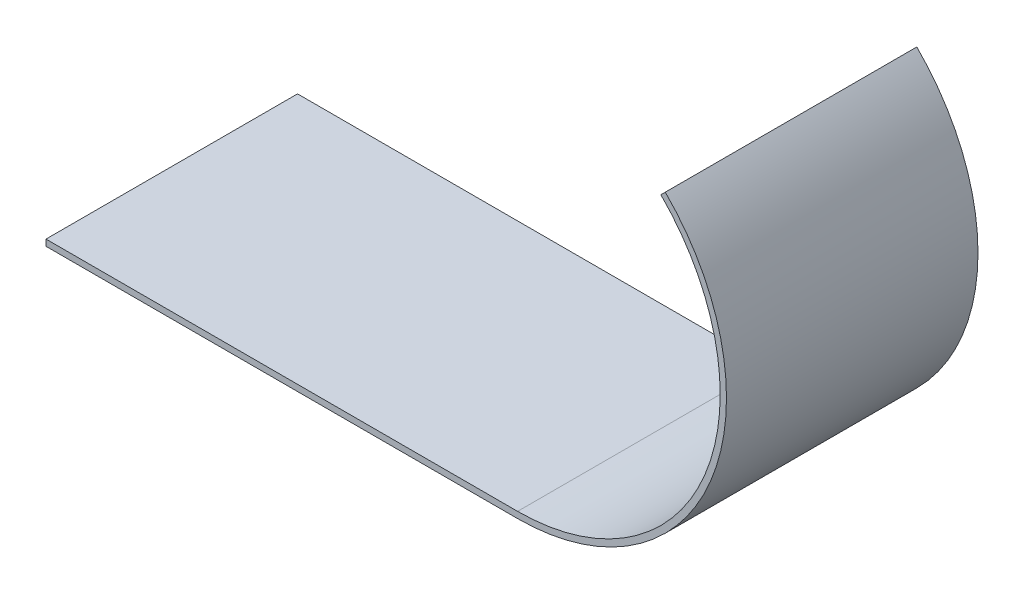
ISO-10303-21;
HEADER;
FILE_DESCRIPTION(('STEP AP214'),'2;1');
FILE_NAME('part.step','',(''),(''),'','','');
FILE_SCHEMA(('AUTOMOTIVE_DESIGN { 1 0 10303 214 1 1 1 1 }'));
ENDSEC;
DATA;
#1=APPLICATION_CONTEXT('core data for automotive mechanical design processes');
#2=APPLICATION_PROTOCOL_DEFINITION('international standard','automotive_design',2000,#1);
#3=PRODUCT_CONTEXT('',#1,'mechanical');
#4=PRODUCT('Part','Part','',(#3));
#5=PRODUCT_RELATED_PRODUCT_CATEGORY('part','',(#4));
#6=PRODUCT_DEFINITION_FORMATION('','',#4);
#7=PRODUCT_DEFINITION_CONTEXT('part definition',#1,'design');
#8=PRODUCT_DEFINITION('design','',#6,#7);
#9=PRODUCT_DEFINITION_SHAPE('','',#8);
#10=(LENGTH_UNIT() NAMED_UNIT(*) SI_UNIT(.MILLI.,.METRE.));
#11=(NAMED_UNIT(*) PLANE_ANGLE_UNIT() SI_UNIT($,.RADIAN.));
#12=(NAMED_UNIT(*) SI_UNIT($,.STERADIAN.) SOLID_ANGLE_UNIT());
#13=UNCERTAINTY_MEASURE_WITH_UNIT(LENGTH_MEASURE(1.E-05),#10,'distance_accuracy_value','');
#14=(GEOMETRIC_REPRESENTATION_CONTEXT(3) GLOBAL_UNCERTAINTY_ASSIGNED_CONTEXT((#13)) GLOBAL_UNIT_ASSIGNED_CONTEXT((#10,
#11,#12)) REPRESENTATION_CONTEXT('',''));
#15=CARTESIAN_POINT('',(0.,0.,0.));
#16=DIRECTION('',(0.,0.,1.));
#17=DIRECTION('',(1.,0.,0.));
#18=AXIS2_PLACEMENT_3D('',#15,#16,#17);
#19=CARTESIAN_POINT('',(150.,64.4365081389595,0.));
#20=DIRECTION('',(0.,0.,-1.));
#21=DIRECTION('',(-1.,0.,0.));
#22=AXIS2_PLACEMENT_3D('',#19,#20,#21);
#23=PLANE('',#22);
#24=CARTESIAN_POINT('',(150.,64.4365081389595,0.));
#25=DIRECTION('',(0.,0.,1.));
#26=DIRECTION('',(1.,0.,0.));
#27=AXIS2_PLACEMENT_3D('',#24,#25,#26);
#28=CIRCLE('',#27,66.4365081389595);
#29=CARTESIAN_POINT('',(150.,-1.99999999999999,0.));
#30=VERTEX_POINT('',#29);
#31=CARTESIAN_POINT('',(196.977705423413,111.414213562373,0.));
#32=VERTEX_POINT('',#31);
#33=EDGE_CURVE('E136',#30,#32,#28,.T.);
#34=ORIENTED_EDGE('',*,*,#33,.F.);
#35=DIRECTION('',(1.,0.,0.));
#36=VECTOR('',#35,1.);
#37=CARTESIAN_POINT('',(0.,-2.,0.));
#38=LINE('',#37,#36);
#39=CARTESIAN_POINT('',(0.,-2.,0.));
#40=VERTEX_POINT('',#39);
#41=EDGE_CURVE('E132',#40,#30,#38,.T.);
#42=ORIENTED_EDGE('',*,*,#41,.F.);
#43=DIRECTION('',(0.,-1.,0.));
#44=VECTOR('',#43,1.);
#45=CARTESIAN_POINT('',(0.,0.,0.));
#46=LINE('',#45,#44);
#47=CARTESIAN_POINT('',(0.,0.,0.));
#48=VERTEX_POINT('',#47);
#49=EDGE_CURVE('E11',#48,#40,#46,.T.);
#50=ORIENTED_EDGE('',*,*,#49,.F.);
#51=DIRECTION('',(1.,0.,0.));
#52=VECTOR('',#51,1.);
#53=CARTESIAN_POINT('',(0.,0.,0.));
#54=LINE('',#53,#52);
#55=CARTESIAN_POINT('',(150.,0.,0.));
#56=VERTEX_POINT('',#55);
#57=EDGE_CURVE('E119',#48,#56,#54,.T.);
#58=ORIENTED_EDGE('',*,*,#57,.T.);
#59=CARTESIAN_POINT('',(150.,64.4365081389595,0.));
#60=DIRECTION('',(0.,0.,1.));
#61=DIRECTION('',(1.,0.,0.));
#62=AXIS2_PLACEMENT_3D('',#59,#60,#61);
#63=CIRCLE('',#62,64.4365081389595);
#64=CARTESIAN_POINT('',(195.56349186104,110.,0.));
#65=VERTEX_POINT('',#64);
#66=EDGE_CURVE('E111',#56,#65,#63,.T.);
#67=ORIENTED_EDGE('',*,*,#66,.T.);
#68=DIRECTION('',(0.707106781186544,0.707106781186551,0.));
#69=VECTOR('',#68,1.);
#70=CARTESIAN_POINT('',(195.56349186104,110.,0.));
#71=LINE('',#70,#69);
#72=EDGE_CURVE('E51',#65,#32,#71,.T.);
#73=ORIENTED_EDGE('',*,*,#72,.T.);
#74=EDGE_LOOP('',(#34,#42,#50,#58,#67,#73));
#75=FACE_BOUND('',#74,.T.);
#76=ADVANCED_FACE('F41',(#75),#23,.T.);
#77=CARTESIAN_POINT('',(195.56349186104,110.,40.));
#78=DIRECTION('',(-0.707106781186551,0.707106781186544,0.));
#79=DIRECTION('',(0.,0.,1.));
#80=AXIS2_PLACEMENT_3D('',#77,#78,#79);
#81=PLANE('',#80);
#82=ORIENTED_EDGE('',*,*,#72,.F.);
#83=DIRECTION('',(0.,0.,1.));
#84=VECTOR('',#83,1.);
#85=CARTESIAN_POINT('',(195.56349186104,110.,0.));
#86=LINE('',#85,#84);
#87=CARTESIAN_POINT('',(195.56349186104,110.,80.));
#88=VERTEX_POINT('',#87);
#89=EDGE_CURVE('E107',#65,#88,#86,.T.);
#90=ORIENTED_EDGE('',*,*,#89,.T.);
#91=DIRECTION('',(0.707106781186544,0.707106781186551,0.));
#92=VECTOR('',#91,1.);
#93=CARTESIAN_POINT('',(195.56349186104,110.,80.));
#94=LINE('',#93,#92);
#95=CARTESIAN_POINT('',(196.977705423413,111.414213562373,80.));
#96=VERTEX_POINT('',#95);
#97=EDGE_CURVE('E93',#88,#96,#94,.T.);
#98=ORIENTED_EDGE('',*,*,#97,.T.);
#99=DIRECTION('',(0.,0.,1.));
#100=VECTOR('',#99,1.);
#101=CARTESIAN_POINT('',(196.977705423413,111.414213562373,0.));
#102=LINE('',#101,#100);
#103=EDGE_CURVE('E138',#32,#96,#102,.T.);
#104=ORIENTED_EDGE('',*,*,#103,.F.);
#105=EDGE_LOOP('',(#82,#90,#98,#104));
#106=FACE_BOUND('',#105,.T.);
#107=ADVANCED_FACE('F109',(#106),#81,.T.);
#108=CARTESIAN_POINT('',(0.,0.,80.));
#109=DIRECTION('',(0.,0.,-1.));
#110=DIRECTION('',(1.,0.,0.));
#111=AXIS2_PLACEMENT_3D('',#108,#109,#110);
#112=PLANE('',#111);
#113=DIRECTION('',(1.,0.,0.));
#114=VECTOR('',#113,1.);
#115=CARTESIAN_POINT('',(0.,-2.,80.));
#116=LINE('',#115,#114);
#117=CARTESIAN_POINT('',(0.,-2.,80.));
#118=VERTEX_POINT('',#117);
#119=CARTESIAN_POINT('',(150.,-2.,80.));
#120=VERTEX_POINT('',#119);
#121=EDGE_CURVE('E133',#118,#120,#116,.T.);
#122=ORIENTED_EDGE('',*,*,#121,.T.);
#123=CARTESIAN_POINT('',(150.,64.4365081389595,80.));
#124=DIRECTION('',(0.,0.,1.));
#125=DIRECTION('',(1.,0.,0.));
#126=AXIS2_PLACEMENT_3D('',#123,#124,#125);
#127=CIRCLE('',#126,66.4365081389595);
#128=EDGE_CURVE('E99',#120,#96,#127,.T.);
#129=ORIENTED_EDGE('',*,*,#128,.T.);
#130=ORIENTED_EDGE('',*,*,#97,.F.);
#131=CARTESIAN_POINT('',(150.,64.4365081389595,80.));
#132=DIRECTION('',(0.,0.,1.));
#133=DIRECTION('',(1.,0.,0.));
#134=AXIS2_PLACEMENT_3D('',#131,#132,#133);
#135=CIRCLE('',#134,64.4365081389595);
#136=CARTESIAN_POINT('',(150.,0.,80.));
#137=VERTEX_POINT('',#136);
#138=EDGE_CURVE('E97',#137,#88,#135,.T.);
#139=ORIENTED_EDGE('',*,*,#138,.F.);
#140=DIRECTION('',(1.,0.,0.));
#141=VECTOR('',#140,1.);
#142=CARTESIAN_POINT('',(0.,0.,80.));
#143=LINE('',#142,#141);
#144=CARTESIAN_POINT('',(0.,0.,80.));
#145=VERTEX_POINT('',#144);
#146=EDGE_CURVE('E110',#145,#137,#143,.T.);
#147=ORIENTED_EDGE('',*,*,#146,.F.);
#148=DIRECTION('',(0.,-1.,0.));
#149=VECTOR('',#148,1.);
#150=CARTESIAN_POINT('',(0.,0.,80.));
#151=LINE('',#150,#149);
#152=EDGE_CURVE('E45',#145,#118,#151,.T.);
#153=ORIENTED_EDGE('',*,*,#152,.T.);
#154=EDGE_LOOP('',(#122,#129,#130,#139,#147,#153));
#155=FACE_BOUND('',#154,.T.);
#156=ADVANCED_FACE('F95',(#155),#112,.F.);
#157=CARTESIAN_POINT('',(0.,0.,0.));
#158=DIRECTION('',(1.,0.,0.));
#159=DIRECTION('',(0.,0.,1.));
#160=AXIS2_PLACEMENT_3D('',#157,#158,#159);
#161=PLANE('',#160);
#162=DIRECTION('',(0.,0.,1.));
#163=VECTOR('',#162,1.);
#164=CARTESIAN_POINT('',(0.,0.,0.));
#165=LINE('',#164,#163);
#166=EDGE_CURVE('E113',#48,#145,#165,.T.);
#167=ORIENTED_EDGE('',*,*,#166,.F.);
#168=ORIENTED_EDGE('',*,*,#49,.T.);
#169=DIRECTION('',(0.,0.,-1.));
#170=VECTOR('',#169,1.);
#171=CARTESIAN_POINT('',(0.,-2.,0.));
#172=LINE('',#171,#170);
#173=EDGE_CURVE('E129',#40,#118,#172,.F.);
#174=ORIENTED_EDGE('',*,*,#173,.T.);
#175=ORIENTED_EDGE('',*,*,#152,.F.);
#176=EDGE_LOOP('',(#167,#168,#174,#175));
#177=FACE_BOUND('',#176,.T.);
#178=ADVANCED_FACE('F43',(#177),#161,.F.);
#179=CARTESIAN_POINT('',(0.,-2.,0.));
#180=DIRECTION('',(0.,-1.,0.));
#181=DIRECTION('',(0.,0.,-1.));
#182=AXIS2_PLACEMENT_3D('',#179,#180,#181);
#183=PLANE('',#182);
#184=ORIENTED_EDGE('',*,*,#121,.F.);
#185=ORIENTED_EDGE('',*,*,#173,.F.);
#186=ORIENTED_EDGE('',*,*,#41,.T.);
#187=DIRECTION('',(0.,0.,-1.));
#188=VECTOR('',#187,1.);
#189=CARTESIAN_POINT('',(150.,-2.,0.));
#190=LINE('',#189,#188);
#191=EDGE_CURVE('E126',#30,#120,#190,.F.);
#192=ORIENTED_EDGE('',*,*,#191,.T.);
#193=EDGE_LOOP('',(#184,#185,#186,#192));
#194=FACE_BOUND('',#193,.T.);
#195=ADVANCED_FACE('F145',(#194),#183,.T.);
#196=CARTESIAN_POINT('',(150.,64.4365081389595,0.));
#197=DIRECTION('',(0.,0.,1.));
#198=DIRECTION('',(1.,0.,0.));
#199=AXIS2_PLACEMENT_3D('',#196,#197,#198);
#200=CYLINDRICAL_SURFACE('',#199,66.4365081389595);
#201=ORIENTED_EDGE('',*,*,#128,.F.);
#202=ORIENTED_EDGE('',*,*,#191,.F.);
#203=ORIENTED_EDGE('',*,*,#33,.T.);
#204=ORIENTED_EDGE('',*,*,#103,.T.);
#205=EDGE_LOOP('',(#201,#202,#203,#204));
#206=FACE_BOUND('',#205,.T.);
#207=ADVANCED_FACE('F149',(#206),#200,.T.);
#208=CARTESIAN_POINT('',(0.,0.,0.));
#209=DIRECTION('',(0.,-1.,0.));
#210=DIRECTION('',(0.,0.,-1.));
#211=AXIS2_PLACEMENT_3D('',#208,#209,#210);
#212=PLANE('',#211);
#213=ORIENTED_EDGE('',*,*,#146,.T.);
#214=DIRECTION('',(0.,0.,1.));
#215=VECTOR('',#214,1.);
#216=CARTESIAN_POINT('',(150.,0.,0.));
#217=LINE('',#216,#215);
#218=EDGE_CURVE('E86',#56,#137,#217,.T.);
#219=ORIENTED_EDGE('',*,*,#218,.F.);
#220=ORIENTED_EDGE('',*,*,#57,.F.);
#221=ORIENTED_EDGE('',*,*,#166,.T.);
#222=EDGE_LOOP('',(#213,#219,#220,#221));
#223=FACE_BOUND('',#222,.T.);
#224=ADVANCED_FACE('F159',(#223),#212,.F.);
#225=CARTESIAN_POINT('',(150.,64.4365081389595,0.));
#226=DIRECTION('',(0.,0.,1.));
#227=DIRECTION('',(1.,0.,0.));
#228=AXIS2_PLACEMENT_3D('',#225,#226,#227);
#229=CYLINDRICAL_SURFACE('',#228,64.4365081389595);
#230=ORIENTED_EDGE('',*,*,#138,.T.);
#231=ORIENTED_EDGE('',*,*,#89,.F.);
#232=ORIENTED_EDGE('',*,*,#66,.F.);
#233=ORIENTED_EDGE('',*,*,#218,.T.);
#234=EDGE_LOOP('',(#230,#231,#232,#233));
#235=FACE_BOUND('',#234,.T.);
#236=ADVANCED_FACE('F106',(#235),#229,.F.);
#237=CLOSED_SHELL('',(#76,#107,#156,#178,#195,#207,#224,#236));
#238=MANIFOLD_SOLID_BREP('B2',#237);
#239=ADVANCED_BREP_SHAPE_REPRESENTATION('',(#18,#238),#14);
#240=SHAPE_DEFINITION_REPRESENTATION(#9,#239);
ENDSEC;
END-ISO-10303-21;
